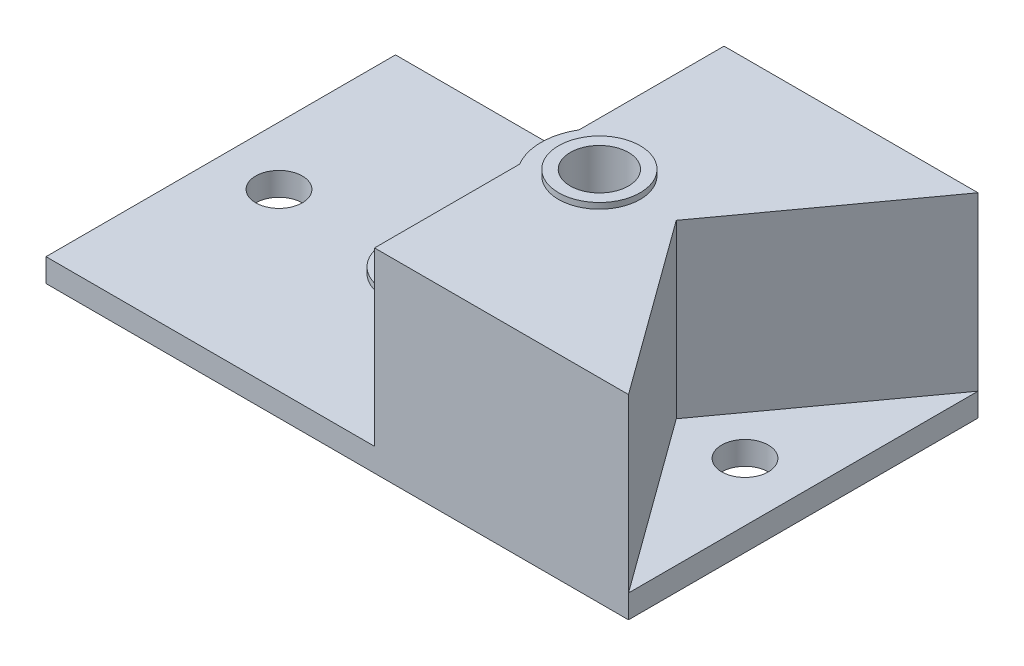
ISO-10303-21;
HEADER;
FILE_DESCRIPTION(('STEP AP214'),'2;1');
FILE_NAME('part.step','',(''),(''),'','','');
FILE_SCHEMA(('AUTOMOTIVE_DESIGN { 1 0 10303 214 1 1 1 1 }'));
ENDSEC;
DATA;
#1=APPLICATION_CONTEXT('core data for automotive mechanical design processes');
#2=APPLICATION_PROTOCOL_DEFINITION('international standard','automotive_design',2000,#1);
#3=PRODUCT_CONTEXT('',#1,'mechanical');
#4=PRODUCT('Part','Part','',(#3));
#5=PRODUCT_RELATED_PRODUCT_CATEGORY('part','',(#4));
#6=PRODUCT_DEFINITION_FORMATION('','',#4);
#7=PRODUCT_DEFINITION_CONTEXT('part definition',#1,'design');
#8=PRODUCT_DEFINITION('design','',#6,#7);
#9=PRODUCT_DEFINITION_SHAPE('','',#8);
#10=(LENGTH_UNIT() NAMED_UNIT(*) SI_UNIT(.MILLI.,.METRE.));
#11=(NAMED_UNIT(*) PLANE_ANGLE_UNIT() SI_UNIT($,.RADIAN.));
#12=(NAMED_UNIT(*) SI_UNIT($,.STERADIAN.) SOLID_ANGLE_UNIT());
#13=UNCERTAINTY_MEASURE_WITH_UNIT(LENGTH_MEASURE(1.E-05),#10,'distance_accuracy_value','');
#14=(GEOMETRIC_REPRESENTATION_CONTEXT(3) GLOBAL_UNCERTAINTY_ASSIGNED_CONTEXT((#13)) GLOBAL_UNIT_ASSIGNED_CONTEXT((#10,
#11,#12)) REPRESENTATION_CONTEXT('',''));
#15=CARTESIAN_POINT('',(0.,0.,0.));
#16=DIRECTION('',(0.,0.,1.));
#17=DIRECTION('',(1.,0.,0.));
#18=AXIS2_PLACEMENT_3D('',#15,#16,#17);
#19=CARTESIAN_POINT('',(0.,2.,0.));
#20=DIRECTION('',(0.,-1.,0.));
#21=DIRECTION('',(0.,0.,-1.));
#22=AXIS2_PLACEMENT_3D('',#19,#20,#21);
#23=PLANE('',#22);
#24=CARTESIAN_POINT('',(45.,2.,-15.));
#25=DIRECTION('',(0.,1.,0.));
#26=DIRECTION('',(0.,0.,1.));
#27=AXIS2_PLACEMENT_3D('',#24,#25,#26);
#28=CIRCLE('',#27,2.);
#29=CARTESIAN_POINT('',(45.,2.,-13.));
#30=VERTEX_POINT('',#29);
#31=EDGE_CURVE('E207',#30,#30,#28,.T.);
#32=ORIENTED_EDGE('',*,*,#31,.F.);
#33=EDGE_LOOP('',(#32));
#34=FACE_BOUND('',#33,.T.);
#35=DIRECTION('',(-0.587837287347272,0.,-0.808979186137815));
#36=VECTOR('',#35,1.);
#37=CARTESIAN_POINT('',(32.7223661802101,2.,-23.7774065149828));
#38=LINE('',#37,#36);
#39=CARTESIAN_POINT('',(50.,2.,0.));
#40=VERTEX_POINT('',#39);
#41=CARTESIAN_POINT('',(39.1003879193661,2.,-15.));
#42=VERTEX_POINT('',#41);
#43=EDGE_CURVE('E185',#40,#42,#38,.T.);
#44=ORIENTED_EDGE('',*,*,#43,.F.);
#45=DIRECTION('',(0.,0.,-1.));
#46=VECTOR('',#45,1.);
#47=CARTESIAN_POINT('',(50.,2.,0.));
#48=LINE('',#47,#46);
#49=CARTESIAN_POINT('',(50.,2.,-30.));
#50=VERTEX_POINT('',#49);
#51=EDGE_CURVE('E192',#40,#50,#48,.T.);
#52=ORIENTED_EDGE('',*,*,#51,.T.);
#53=DIRECTION('',(0.587837287347272,0.,-0.808979186137815));
#54=VECTOR('',#53,1.);
#55=CARTESIAN_POINT('',(18.4559222712204,2.,13.4108262231089));
#56=LINE('',#55,#54);
#57=EDGE_CURVE('E177',#42,#50,#56,.T.);
#58=ORIENTED_EDGE('',*,*,#57,.F.);
#59=EDGE_LOOP('',(#44,#52,#58));
#60=FACE_BOUND('',#59,.T.);
#61=ADVANCED_FACE('F35',(#34,#60),#23,.F.);
#62=CARTESIAN_POINT('',(17.5,2.,-15.));
#63=DIRECTION('',(0.,-1.,0.));
#64=DIRECTION('',(0.,0.,-1.));
#65=AXIS2_PLACEMENT_3D('',#62,#63,#64);
#66=CIRCLE('',#65,3.5);
#67=CARTESIAN_POINT('',(17.5,2.,-18.5));
#68=VERTEX_POINT('',#67);
#69=EDGE_CURVE('E11',#68,#68,#66,.F.);
#70=ORIENTED_EDGE('',*,*,#69,.F.);
#71=EDGE_LOOP('',(#70));
#72=FACE_BOUND('',#71,.T.);
#73=CARTESIAN_POINT('',(5.,2.,-15.));
#74=DIRECTION('',(0.,1.,0.));
#75=DIRECTION('',(0.,0.,1.));
#76=AXIS2_PLACEMENT_3D('',#73,#74,#75);
#77=CIRCLE('',#76,2.);
#78=CARTESIAN_POINT('',(5.,2.,-13.));
#79=VERTEX_POINT('',#78);
#80=EDGE_CURVE('E102',#79,#79,#77,.T.);
#81=ORIENTED_EDGE('',*,*,#80,.F.);
#82=EDGE_LOOP('',(#81));
#83=FACE_BOUND('',#82,.T.);
#84=DIRECTION('',(0.,0.,1.));
#85=VECTOR('',#84,1.);
#86=CARTESIAN_POINT('',(28.2007758387323,2.,0.));
#87=LINE('',#86,#85);
#88=CARTESIAN_POINT('',(28.2007758387323,2.,-30.));
#89=VERTEX_POINT('',#88);
#90=CARTESIAN_POINT('',(28.2007758387323,2.,-17.552777234929));
#91=VERTEX_POINT('',#90);
#92=EDGE_CURVE('E134',#89,#91,#87,.T.);
#93=ORIENTED_EDGE('',*,*,#92,.F.);
#94=DIRECTION('',(-1.,0.,0.));
#95=VECTOR('',#94,1.);
#96=CARTESIAN_POINT('',(0.,2.,-30.));
#97=LINE('',#96,#95);
#98=CARTESIAN_POINT('',(0.,2.,-30.));
#99=VERTEX_POINT('',#98);
#100=EDGE_CURVE('E59',#89,#99,#97,.T.);
#101=ORIENTED_EDGE('',*,*,#100,.T.);
#102=DIRECTION('',(0.,0.,1.));
#103=VECTOR('',#102,1.);
#104=CARTESIAN_POINT('',(0.,2.,0.));
#105=LINE('',#104,#103);
#106=CARTESIAN_POINT('',(0.,2.,0.));
#107=VERTEX_POINT('',#106);
#108=EDGE_CURVE('E90',#99,#107,#105,.T.);
#109=ORIENTED_EDGE('',*,*,#108,.T.);
#110=DIRECTION('',(1.,0.,0.));
#111=VECTOR('',#110,1.);
#112=CARTESIAN_POINT('',(0.,2.,0.));
#113=LINE('',#112,#111);
#114=CARTESIAN_POINT('',(28.2007758387323,2.,0.));
#115=VERTEX_POINT('',#114);
#116=EDGE_CURVE('E195',#107,#115,#113,.T.);
#117=ORIENTED_EDGE('',*,*,#116,.T.);
#118=DIRECTION('',(0.,0.,1.));
#119=VECTOR('',#118,1.);
#120=CARTESIAN_POINT('',(28.2007758387323,2.,0.));
#121=LINE('',#120,#119);
#122=CARTESIAN_POINT('',(28.2007758387323,2.,-12.447222765071));
#123=VERTEX_POINT('',#122);
#124=EDGE_CURVE('E137',#123,#115,#121,.T.);
#125=ORIENTED_EDGE('',*,*,#124,.F.);
#126=CARTESIAN_POINT('',(32.5,2.,-15.));
#127=DIRECTION('',(0.,-1.,0.));
#128=DIRECTION('',(0.,0.,-1.));
#129=AXIS2_PLACEMENT_3D('',#126,#127,#128);
#130=CIRCLE('',#129,5.);
#131=EDGE_CURVE('E43',#91,#123,#130,.F.);
#132=ORIENTED_EDGE('',*,*,#131,.F.);
#133=EDGE_LOOP('',(#93,#101,#109,#117,#125,#132));
#134=FACE_BOUND('',#133,.T.);
#135=ADVANCED_FACE('F132',(#72,#83,#134),#23,.F.);
#136=CARTESIAN_POINT('',(32.5,16.75,-15.));
#137=DIRECTION('',(0.,-1.,0.));
#138=DIRECTION('',(0.,0.,-1.));
#139=AXIS2_PLACEMENT_3D('',#136,#137,#138);
#140=CYLINDRICAL_SURFACE('',#139,5.);
#141=DIRECTION('',(0.,-1.,0.));
#142=VECTOR('',#141,1.);
#143=CARTESIAN_POINT('',(28.2007758387323,16.75,-17.552777234929));
#144=LINE('',#143,#142);
#145=CARTESIAN_POINT('',(28.2007758387323,16.75,-17.552777234929));
#146=VERTEX_POINT('',#145);
#147=EDGE_CURVE('E50',#146,#91,#144,.T.);
#148=ORIENTED_EDGE('',*,*,#147,.T.);
#149=ORIENTED_EDGE('',*,*,#131,.T.);
#150=DIRECTION('',(0.,-1.,0.));
#151=VECTOR('',#150,1.);
#152=CARTESIAN_POINT('',(28.2007758387323,16.75,-12.447222765071));
#153=LINE('',#152,#151);
#154=CARTESIAN_POINT('',(28.2007758387323,16.75,-12.447222765071));
#155=VERTEX_POINT('',#154);
#156=EDGE_CURVE('E126',#155,#123,#153,.T.);
#157=ORIENTED_EDGE('',*,*,#156,.F.);
#158=CARTESIAN_POINT('',(32.5,16.75,-15.));
#159=DIRECTION('',(0.,1.,0.));
#160=DIRECTION('',(0.,0.,1.));
#161=AXIS2_PLACEMENT_3D('',#158,#159,#160);
#162=CIRCLE('',#161,5.);
#163=EDGE_CURVE('E220',#146,#155,#162,.T.);
#164=ORIENTED_EDGE('',*,*,#163,.F.);
#165=EDGE_LOOP('',(#148,#149,#157,#164));
#166=FACE_BOUND('',#165,.T.);
#167=ADVANCED_FACE('F122',(#166),#140,.T.);
#168=CARTESIAN_POINT('',(32.5,16.75,-15.));
#169=DIRECTION('',(0.,1.,0.));
#170=DIRECTION('',(0.,0.,1.));
#171=AXIS2_PLACEMENT_3D('',#168,#169,#170);
#172=PLANE('',#171);
#173=ORIENTED_EDGE('',*,*,#163,.T.);
#174=DIRECTION('',(0.,0.,1.));
#175=VECTOR('',#174,1.);
#176=CARTESIAN_POINT('',(28.2007758387323,16.75,0.));
#177=LINE('',#176,#175);
#178=CARTESIAN_POINT('',(28.2007758387323,16.75,0.));
#179=VERTEX_POINT('',#178);
#180=EDGE_CURVE('E249',#155,#179,#177,.T.);
#181=ORIENTED_EDGE('',*,*,#180,.T.);
#182=DIRECTION('',(1.,0.,0.));
#183=VECTOR('',#182,1.);
#184=CARTESIAN_POINT('',(0.,16.75,0.));
#185=LINE('',#184,#183);
#186=CARTESIAN_POINT('',(50.,16.75,0.));
#187=VERTEX_POINT('',#186);
#188=EDGE_CURVE('E243',#179,#187,#185,.T.);
#189=ORIENTED_EDGE('',*,*,#188,.T.);
#190=DIRECTION('',(-0.587837287347272,0.,-0.808979186137815));
#191=VECTOR('',#190,1.);
#192=CARTESIAN_POINT('',(32.7223661802101,16.75,-23.7774065149828));
#193=LINE('',#192,#191);
#194=CARTESIAN_POINT('',(39.1003879193661,16.75,-15.));
#195=VERTEX_POINT('',#194);
#196=EDGE_CURVE('E245',#187,#195,#193,.T.);
#197=ORIENTED_EDGE('',*,*,#196,.T.);
#198=DIRECTION('',(0.587837287347272,0.,-0.808979186137815));
#199=VECTOR('',#198,1.);
#200=CARTESIAN_POINT('',(18.4559222712204,16.75,13.4108262231089));
#201=LINE('',#200,#199);
#202=CARTESIAN_POINT('',(50.,16.75,-30.));
#203=VERTEX_POINT('',#202);
#204=EDGE_CURVE('E160',#195,#203,#201,.T.);
#205=ORIENTED_EDGE('',*,*,#204,.T.);
#206=DIRECTION('',(-1.,0.,0.));
#207=VECTOR('',#206,1.);
#208=CARTESIAN_POINT('',(0.,16.75,-30.));
#209=LINE('',#208,#207);
#210=CARTESIAN_POINT('',(28.2007758387323,16.75,-30.));
#211=VERTEX_POINT('',#210);
#212=EDGE_CURVE('E188',#203,#211,#209,.T.);
#213=ORIENTED_EDGE('',*,*,#212,.T.);
#214=DIRECTION('',(0.,0.,1.));
#215=VECTOR('',#214,1.);
#216=CARTESIAN_POINT('',(28.2007758387323,16.75,0.));
#217=LINE('',#216,#215);
#218=EDGE_CURVE('E251',#211,#146,#217,.T.);
#219=ORIENTED_EDGE('',*,*,#218,.T.);
#220=EDGE_LOOP('',(#173,#181,#189,#197,#205,#213,#219));
#221=FACE_BOUND('',#220,.T.);
#222=CARTESIAN_POINT('',(32.5,16.75,-15.));
#223=DIRECTION('',(0.,1.,0.));
#224=DIRECTION('',(0.,0.,1.));
#225=AXIS2_PLACEMENT_3D('',#222,#223,#224);
#226=CIRCLE('',#225,3.5);
#227=CARTESIAN_POINT('',(32.5,16.75,-11.5));
#228=VERTEX_POINT('',#227);
#229=EDGE_CURVE('E229',#228,#228,#226,.T.);
#230=ORIENTED_EDGE('',*,*,#229,.F.);
#231=EDGE_LOOP('',(#230));
#232=FACE_BOUND('',#231,.T.);
#233=ADVANCED_FACE('F256',(#221,#232),#172,.T.);
#234=CARTESIAN_POINT('',(0.,0.,0.));
#235=DIRECTION('',(0.,-1.,0.));
#236=DIRECTION('',(0.,0.,-1.));
#237=AXIS2_PLACEMENT_3D('',#234,#235,#236);
#238=PLANE('',#237);
#239=CARTESIAN_POINT('',(17.5,0.,-15.));
#240=DIRECTION('',(0.,1.,0.));
#241=DIRECTION('',(0.,0.,1.));
#242=AXIS2_PLACEMENT_3D('',#239,#240,#241);
#243=CIRCLE('',#242,2.5);
#244=CARTESIAN_POINT('',(17.5,0.,-12.5));
#245=VERTEX_POINT('',#244);
#246=EDGE_CURVE('E212',#245,#245,#243,.T.);
#247=ORIENTED_EDGE('',*,*,#246,.T.);
#248=EDGE_LOOP('',(#247));
#249=FACE_BOUND('',#248,.T.);
#250=CARTESIAN_POINT('',(5.,0.,-15.));
#251=DIRECTION('',(0.,1.,0.));
#252=DIRECTION('',(0.,0.,1.));
#253=AXIS2_PLACEMENT_3D('',#250,#251,#252);
#254=CIRCLE('',#253,2.);
#255=CARTESIAN_POINT('',(5.,0.,-13.));
#256=VERTEX_POINT('',#255);
#257=EDGE_CURVE('E106',#256,#256,#254,.T.);
#258=ORIENTED_EDGE('',*,*,#257,.T.);
#259=EDGE_LOOP('',(#258));
#260=FACE_BOUND('',#259,.T.);
#261=DIRECTION('',(0.,0.,1.));
#262=VECTOR('',#261,1.);
#263=CARTESIAN_POINT('',(0.,0.,0.));
#264=LINE('',#263,#262);
#265=CARTESIAN_POINT('',(0.,0.,-30.));
#266=VERTEX_POINT('',#265);
#267=CARTESIAN_POINT('',(0.,0.,0.));
#268=VERTEX_POINT('',#267);
#269=EDGE_CURVE('E96',#266,#268,#264,.T.);
#270=ORIENTED_EDGE('',*,*,#269,.F.);
#271=DIRECTION('',(-1.,0.,0.));
#272=VECTOR('',#271,1.);
#273=CARTESIAN_POINT('',(0.,0.,-30.));
#274=LINE('',#273,#272);
#275=CARTESIAN_POINT('',(50.,0.,-30.));
#276=VERTEX_POINT('',#275);
#277=EDGE_CURVE('E79',#276,#266,#274,.T.);
#278=ORIENTED_EDGE('',*,*,#277,.F.);
#279=DIRECTION('',(0.,0.,-1.));
#280=VECTOR('',#279,1.);
#281=CARTESIAN_POINT('',(50.,0.,0.));
#282=LINE('',#281,#280);
#283=CARTESIAN_POINT('',(50.,0.,0.));
#284=VERTEX_POINT('',#283);
#285=EDGE_CURVE('E91',#284,#276,#282,.T.);
#286=ORIENTED_EDGE('',*,*,#285,.F.);
#287=DIRECTION('',(1.,0.,0.));
#288=VECTOR('',#287,1.);
#289=CARTESIAN_POINT('',(0.,0.,0.));
#290=LINE('',#289,#288);
#291=EDGE_CURVE('E100',#268,#284,#290,.T.);
#292=ORIENTED_EDGE('',*,*,#291,.F.);
#293=EDGE_LOOP('',(#270,#278,#286,#292));
#294=FACE_BOUND('',#293,.T.);
#295=CARTESIAN_POINT('',(45.,0.,-15.));
#296=DIRECTION('',(0.,1.,0.));
#297=DIRECTION('',(0.,0.,1.));
#298=AXIS2_PLACEMENT_3D('',#295,#296,#297);
#299=CIRCLE('',#298,2.);
#300=CARTESIAN_POINT('',(45.,0.,-13.));
#301=VERTEX_POINT('',#300);
#302=EDGE_CURVE('E209',#301,#301,#299,.T.);
#303=ORIENTED_EDGE('',*,*,#302,.T.);
#304=EDGE_LOOP('',(#303));
#305=FACE_BOUND('',#304,.T.);
#306=CARTESIAN_POINT('',(32.5,0.,-15.));
#307=DIRECTION('',(0.,1.,0.));
#308=DIRECTION('',(0.,0.,1.));
#309=AXIS2_PLACEMENT_3D('',#306,#307,#308);
#310=CIRCLE('',#309,2.5);
#311=CARTESIAN_POINT('',(32.5,0.,-12.5));
#312=VERTEX_POINT('',#311);
#313=EDGE_CURVE('E217',#312,#312,#310,.T.);
#314=ORIENTED_EDGE('',*,*,#313,.T.);
#315=EDGE_LOOP('',(#314));
#316=FACE_BOUND('',#315,.T.);
#317=ADVANCED_FACE('F98',(#249,#260,#294,#305,#316),#238,.T.);
#318=CARTESIAN_POINT('',(0.,2.,0.));
#319=DIRECTION('',(1.,0.,0.));
#320=DIRECTION('',(0.,0.,-1.));
#321=AXIS2_PLACEMENT_3D('',#318,#319,#320);
#322=PLANE('',#321);
#323=ORIENTED_EDGE('',*,*,#269,.T.);
#324=DIRECTION('',(0.,-1.,0.));
#325=VECTOR('',#324,1.);
#326=CARTESIAN_POINT('',(0.,2.,0.));
#327=LINE('',#326,#325);
#328=EDGE_CURVE('E116',#107,#268,#327,.T.);
#329=ORIENTED_EDGE('',*,*,#328,.F.);
#330=ORIENTED_EDGE('',*,*,#108,.F.);
#331=DIRECTION('',(0.,-1.,0.));
#332=VECTOR('',#331,1.);
#333=CARTESIAN_POINT('',(0.,2.,-30.));
#334=LINE('',#333,#332);
#335=EDGE_CURVE('E82',#99,#266,#334,.T.);
#336=ORIENTED_EDGE('',*,*,#335,.T.);
#337=EDGE_LOOP('',(#323,#329,#330,#336));
#338=FACE_BOUND('',#337,.T.);
#339=ADVANCED_FACE('F37',(#338),#322,.F.);
#340=CARTESIAN_POINT('',(0.,2.,0.));
#341=DIRECTION('',(0.,0.,-1.));
#342=DIRECTION('',(-1.,0.,0.));
#343=AXIS2_PLACEMENT_3D('',#340,#341,#342);
#344=PLANE('',#343);
#345=ORIENTED_EDGE('',*,*,#291,.T.);
#346=DIRECTION('',(0.,-1.,0.));
#347=VECTOR('',#346,1.);
#348=CARTESIAN_POINT('',(50.,2.,0.));
#349=LINE('',#348,#347);
#350=EDGE_CURVE('E113',#40,#284,#349,.T.);
#351=ORIENTED_EDGE('',*,*,#350,.F.);
#352=DIRECTION('',(0.,-1.,0.));
#353=VECTOR('',#352,1.);
#354=CARTESIAN_POINT('',(50.,16.75,0.));
#355=LINE('',#354,#353);
#356=EDGE_CURVE('E151',#187,#40,#355,.T.);
#357=ORIENTED_EDGE('',*,*,#356,.F.);
#358=ORIENTED_EDGE('',*,*,#188,.F.);
#359=DIRECTION('',(0.,-1.,0.));
#360=VECTOR('',#359,1.);
#361=CARTESIAN_POINT('',(28.2007758387323,16.75,0.));
#362=LINE('',#361,#360);
#363=EDGE_CURVE('E202',#179,#115,#362,.T.);
#364=ORIENTED_EDGE('',*,*,#363,.T.);
#365=ORIENTED_EDGE('',*,*,#116,.F.);
#366=ORIENTED_EDGE('',*,*,#328,.T.);
#367=EDGE_LOOP('',(#345,#351,#357,#358,#364,#365,#366));
#368=FACE_BOUND('',#367,.T.);
#369=ADVANCED_FACE('F198',(#368),#344,.F.);
#370=CARTESIAN_POINT('',(50.,2.,0.));
#371=DIRECTION('',(-1.,0.,0.));
#372=DIRECTION('',(0.,0.,1.));
#373=AXIS2_PLACEMENT_3D('',#370,#371,#372);
#374=PLANE('',#373);
#375=ORIENTED_EDGE('',*,*,#285,.T.);
#376=DIRECTION('',(0.,-1.,0.));
#377=VECTOR('',#376,1.);
#378=CARTESIAN_POINT('',(50.,2.,-30.));
#379=LINE('',#378,#377);
#380=EDGE_CURVE('E86',#50,#276,#379,.T.);
#381=ORIENTED_EDGE('',*,*,#380,.F.);
#382=ORIENTED_EDGE('',*,*,#51,.F.);
#383=ORIENTED_EDGE('',*,*,#350,.T.);
#384=EDGE_LOOP('',(#375,#381,#382,#383));
#385=FACE_BOUND('',#384,.T.);
#386=ADVANCED_FACE('F196',(#385),#374,.F.);
#387=CARTESIAN_POINT('',(0.,2.,-30.));
#388=DIRECTION('',(0.,0.,1.));
#389=DIRECTION('',(1.,0.,0.));
#390=AXIS2_PLACEMENT_3D('',#387,#388,#389);
#391=PLANE('',#390);
#392=ORIENTED_EDGE('',*,*,#277,.T.);
#393=ORIENTED_EDGE('',*,*,#335,.F.);
#394=ORIENTED_EDGE('',*,*,#100,.F.);
#395=DIRECTION('',(0.,-1.,0.));
#396=VECTOR('',#395,1.);
#397=CARTESIAN_POINT('',(28.2007758387323,16.75,-30.));
#398=LINE('',#397,#396);
#399=EDGE_CURVE('E189',#211,#89,#398,.T.);
#400=ORIENTED_EDGE('',*,*,#399,.F.);
#401=ORIENTED_EDGE('',*,*,#212,.F.);
#402=DIRECTION('',(0.,-1.,0.));
#403=VECTOR('',#402,1.);
#404=CARTESIAN_POINT('',(50.,16.75,-30.));
#405=LINE('',#404,#403);
#406=EDGE_CURVE('E179',#203,#50,#405,.T.);
#407=ORIENTED_EDGE('',*,*,#406,.T.);
#408=ORIENTED_EDGE('',*,*,#380,.T.);
#409=EDGE_LOOP('',(#392,#393,#394,#400,#401,#407,#408));
#410=FACE_BOUND('',#409,.T.);
#411=ADVANCED_FACE('F81',(#410),#391,.F.);
#412=CARTESIAN_POINT('',(5.,2.,-15.));
#413=DIRECTION('',(0.,-1.,0.));
#414=DIRECTION('',(0.,0.,-1.));
#415=AXIS2_PLACEMENT_3D('',#412,#413,#414);
#416=CYLINDRICAL_SURFACE('',#415,2.);
#417=ORIENTED_EDGE('',*,*,#80,.T.);
#418=EDGE_LOOP('',(#417));
#419=FACE_BOUND('',#418,.T.);
#420=ORIENTED_EDGE('',*,*,#257,.F.);
#421=EDGE_LOOP('',(#420));
#422=FACE_BOUND('',#421,.T.);
#423=ADVANCED_FACE('F284',(#419,#422),#416,.F.);
#424=CARTESIAN_POINT('',(45.,2.,-15.));
#425=DIRECTION('',(0.,-1.,0.));
#426=DIRECTION('',(0.,0.,-1.));
#427=AXIS2_PLACEMENT_3D('',#424,#425,#426);
#428=CYLINDRICAL_SURFACE('',#427,2.);
#429=ORIENTED_EDGE('',*,*,#31,.T.);
#430=EDGE_LOOP('',(#429));
#431=FACE_BOUND('',#430,.T.);
#432=ORIENTED_EDGE('',*,*,#302,.F.);
#433=EDGE_LOOP('',(#432));
#434=FACE_BOUND('',#433,.T.);
#435=ADVANCED_FACE('F315',(#431,#434),#428,.F.);
#436=CARTESIAN_POINT('',(17.5,2.,-15.));
#437=DIRECTION('',(0.,-1.,0.));
#438=DIRECTION('',(0.,0.,-1.));
#439=AXIS2_PLACEMENT_3D('',#436,#437,#438);
#440=CYLINDRICAL_SURFACE('',#439,2.5);
#441=ORIENTED_EDGE('',*,*,#246,.F.);
#442=EDGE_LOOP('',(#441));
#443=FACE_BOUND('',#442,.T.);
#444=CARTESIAN_POINT('',(17.5,2.5,-15.));
#445=DIRECTION('',(0.,1.,0.));
#446=DIRECTION('',(0.,0.,1.));
#447=AXIS2_PLACEMENT_3D('',#444,#445,#446);
#448=CIRCLE('',#447,2.5);
#449=CARTESIAN_POINT('',(17.5,2.5,-12.5));
#450=VERTEX_POINT('',#449);
#451=EDGE_CURVE('E225',#450,#450,#448,.T.);
#452=ORIENTED_EDGE('',*,*,#451,.T.);
#453=EDGE_LOOP('',(#452));
#454=FACE_BOUND('',#453,.T.);
#455=ADVANCED_FACE('F322',(#443,#454),#440,.F.);
#456=CARTESIAN_POINT('',(32.5,2.,-15.));
#457=DIRECTION('',(0.,-1.,0.));
#458=DIRECTION('',(0.,0.,-1.));
#459=AXIS2_PLACEMENT_3D('',#456,#457,#458);
#460=CYLINDRICAL_SURFACE('',#459,2.5);
#461=ORIENTED_EDGE('',*,*,#313,.F.);
#462=EDGE_LOOP('',(#461));
#463=FACE_BOUND('',#462,.T.);
#464=CARTESIAN_POINT('',(32.5,17.25,-15.));
#465=DIRECTION('',(0.,1.,0.));
#466=DIRECTION('',(0.,0.,1.));
#467=AXIS2_PLACEMENT_3D('',#464,#465,#466);
#468=CIRCLE('',#467,2.5);
#469=CARTESIAN_POINT('',(32.5,17.25,-12.5));
#470=VERTEX_POINT('',#469);
#471=EDGE_CURVE('E232',#470,#470,#468,.T.);
#472=ORIENTED_EDGE('',*,*,#471,.T.);
#473=EDGE_LOOP('',(#472));
#474=FACE_BOUND('',#473,.T.);
#475=ADVANCED_FACE('F329',(#463,#474),#460,.F.);
#476=CARTESIAN_POINT('',(17.5,2.5,-15.));
#477=DIRECTION('',(0.,1.,0.));
#478=DIRECTION('',(0.,0.,1.));
#479=AXIS2_PLACEMENT_3D('',#476,#477,#478);
#480=PLANE('',#479);
#481=CARTESIAN_POINT('',(17.5,2.5,-15.));
#482=DIRECTION('',(0.,1.,0.));
#483=DIRECTION('',(0.,0.,1.));
#484=AXIS2_PLACEMENT_3D('',#481,#482,#483);
#485=CIRCLE('',#484,3.5);
#486=CARTESIAN_POINT('',(17.5,2.5,-11.5));
#487=VERTEX_POINT('',#486);
#488=EDGE_CURVE('E222',#487,#487,#485,.T.);
#489=ORIENTED_EDGE('',*,*,#488,.T.);
#490=EDGE_LOOP('',(#489));
#491=FACE_BOUND('',#490,.T.);
#492=ORIENTED_EDGE('',*,*,#451,.F.);
#493=EDGE_LOOP('',(#492));
#494=FACE_BOUND('',#493,.T.);
#495=ADVANCED_FACE('F338',(#491,#494),#480,.T.);
#496=CARTESIAN_POINT('',(17.5,2.5,-15.));
#497=DIRECTION('',(0.,-1.,0.));
#498=DIRECTION('',(0.,0.,-1.));
#499=AXIS2_PLACEMENT_3D('',#496,#497,#498);
#500=CYLINDRICAL_SURFACE('',#499,3.5);
#501=ORIENTED_EDGE('',*,*,#488,.F.);
#502=EDGE_LOOP('',(#501));
#503=FACE_BOUND('',#502,.T.);
#504=ORIENTED_EDGE('',*,*,#69,.T.);
#505=EDGE_LOOP('',(#504));
#506=FACE_BOUND('',#505,.T.);
#507=ADVANCED_FACE('F347',(#503,#506),#500,.T.);
#508=CARTESIAN_POINT('',(32.5,17.25,-15.));
#509=DIRECTION('',(0.,1.,0.));
#510=DIRECTION('',(0.,0.,1.));
#511=AXIS2_PLACEMENT_3D('',#508,#509,#510);
#512=PLANE('',#511);
#513=CARTESIAN_POINT('',(32.5,17.25,-15.));
#514=DIRECTION('',(0.,1.,0.));
#515=DIRECTION('',(0.,0.,1.));
#516=AXIS2_PLACEMENT_3D('',#513,#514,#515);
#517=CIRCLE('',#516,3.5);
#518=CARTESIAN_POINT('',(32.5,17.25,-11.5));
#519=VERTEX_POINT('',#518);
#520=EDGE_CURVE('E228',#519,#519,#517,.T.);
#521=ORIENTED_EDGE('',*,*,#520,.T.);
#522=EDGE_LOOP('',(#521));
#523=FACE_BOUND('',#522,.T.);
#524=ORIENTED_EDGE('',*,*,#471,.F.);
#525=EDGE_LOOP('',(#524));
#526=FACE_BOUND('',#525,.T.);
#527=ADVANCED_FACE('F269',(#523,#526),#512,.T.);
#528=CARTESIAN_POINT('',(32.5,17.25,-15.));
#529=DIRECTION('',(0.,-1.,0.));
#530=DIRECTION('',(0.,0.,-1.));
#531=AXIS2_PLACEMENT_3D('',#528,#529,#530);
#532=CYLINDRICAL_SURFACE('',#531,3.5);
#533=ORIENTED_EDGE('',*,*,#520,.F.);
#534=EDGE_LOOP('',(#533));
#535=FACE_BOUND('',#534,.T.);
#536=ORIENTED_EDGE('',*,*,#229,.T.);
#537=EDGE_LOOP('',(#536));
#538=FACE_BOUND('',#537,.T.);
#539=ADVANCED_FACE('F260',(#535,#538),#532,.T.);
#540=CARTESIAN_POINT('',(32.7223661802101,16.75,-23.7774065149828));
#541=DIRECTION('',(-0.808979186137815,0.,0.587837287347272));
#542=DIRECTION('',(0.587837287347272,0.,0.808979186137815));
#543=AXIS2_PLACEMENT_3D('',#540,#541,#542);
#544=PLANE('',#543);
#545=ORIENTED_EDGE('',*,*,#43,.T.);
#546=DIRECTION('',(0.,-1.,0.));
#547=VECTOR('',#546,1.);
#548=CARTESIAN_POINT('',(39.1003879193661,16.75,-15.));
#549=LINE('',#548,#547);
#550=EDGE_CURVE('E182',#195,#42,#549,.T.);
#551=ORIENTED_EDGE('',*,*,#550,.F.);
#552=ORIENTED_EDGE('',*,*,#196,.F.);
#553=ORIENTED_EDGE('',*,*,#356,.T.);
#554=EDGE_LOOP('',(#545,#551,#552,#553));
#555=FACE_BOUND('',#554,.T.);
#556=ADVANCED_FACE('F258',(#555),#544,.F.);
#557=CARTESIAN_POINT('',(18.4559222712204,16.75,13.4108262231089));
#558=DIRECTION('',(-0.808979186137815,0.,-0.587837287347272));
#559=DIRECTION('',(-0.587837287347272,0.,0.808979186137815));
#560=AXIS2_PLACEMENT_3D('',#557,#558,#559);
#561=PLANE('',#560);
#562=ORIENTED_EDGE('',*,*,#57,.T.);
#563=ORIENTED_EDGE('',*,*,#406,.F.);
#564=ORIENTED_EDGE('',*,*,#204,.F.);
#565=ORIENTED_EDGE('',*,*,#550,.T.);
#566=EDGE_LOOP('',(#562,#563,#564,#565));
#567=FACE_BOUND('',#566,.T.);
#568=ADVANCED_FACE('F178',(#567),#561,.F.);
#569=CARTESIAN_POINT('',(28.2007758387323,16.75,0.));
#570=DIRECTION('',(1.,0.,0.));
#571=DIRECTION('',(0.,0.,-1.));
#572=AXIS2_PLACEMENT_3D('',#569,#570,#571);
#573=PLANE('',#572);
#574=ORIENTED_EDGE('',*,*,#92,.T.);
#575=ORIENTED_EDGE('',*,*,#147,.F.);
#576=ORIENTED_EDGE('',*,*,#218,.F.);
#577=ORIENTED_EDGE('',*,*,#399,.T.);
#578=EDGE_LOOP('',(#574,#575,#576,#577));
#579=FACE_BOUND('',#578,.T.);
#580=ADVANCED_FACE('F266',(#579),#573,.F.);
#581=CARTESIAN_POINT('',(28.2007758387323,16.75,0.));
#582=DIRECTION('',(1.,0.,0.));
#583=DIRECTION('',(0.,0.,-1.));
#584=AXIS2_PLACEMENT_3D('',#581,#582,#583);
#585=PLANE('',#584);
#586=ORIENTED_EDGE('',*,*,#124,.T.);
#587=ORIENTED_EDGE('',*,*,#363,.F.);
#588=ORIENTED_EDGE('',*,*,#180,.F.);
#589=ORIENTED_EDGE('',*,*,#156,.T.);
#590=EDGE_LOOP('',(#586,#587,#588,#589));
#591=FACE_BOUND('',#590,.T.);
#592=ADVANCED_FACE('F421',(#591),#585,.F.);
#593=CLOSED_SHELL('',(#61,#135,#167,#233,#317,#339,#369,#386,#411,#423,#435,#455,#475,#495,#507,
#527,#539,#556,#568,#580,#592));
#594=MANIFOLD_SOLID_BREP('B2',#593);
#595=ADVANCED_BREP_SHAPE_REPRESENTATION('',(#18,#594),#14);
#596=SHAPE_DEFINITION_REPRESENTATION(#9,#595);
ENDSEC;
END-ISO-10303-21;
